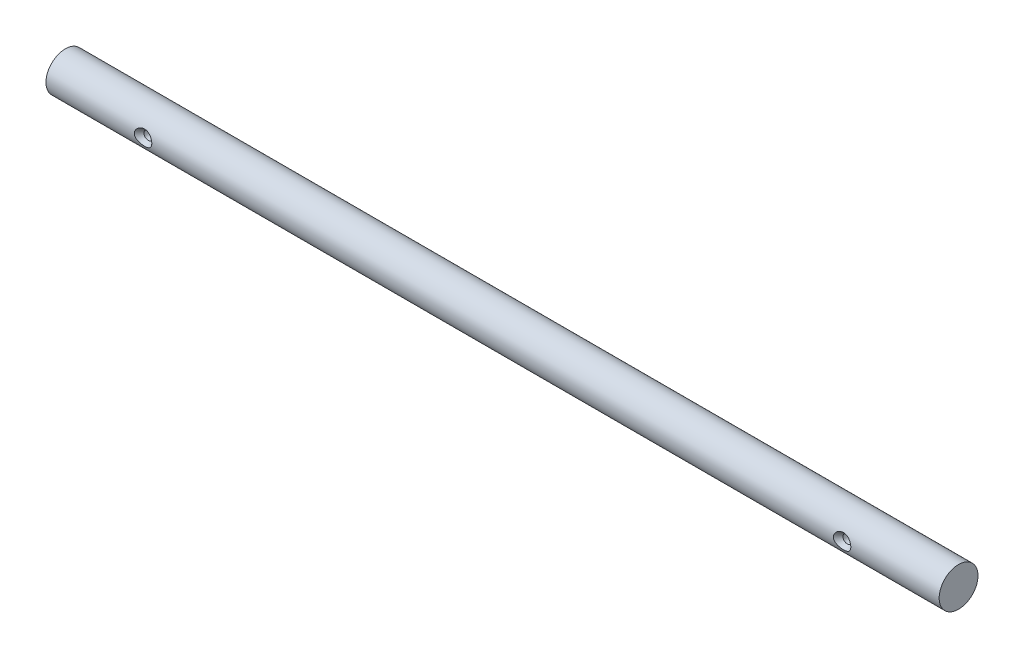
ISO-10303-21;
HEADER;
FILE_DESCRIPTION(('STEP AP214'),'2;1');
FILE_NAME('part.step','',(''),(''),'','','');
FILE_SCHEMA(('AUTOMOTIVE_DESIGN { 1 0 10303 214 1 1 1 1 }'));
ENDSEC;
DATA;
#1=APPLICATION_CONTEXT('core data for automotive mechanical design processes');
#2=APPLICATION_PROTOCOL_DEFINITION('international standard','automotive_design',2000,#1);
#3=PRODUCT_CONTEXT('',#1,'mechanical');
#4=PRODUCT('Part','Part','',(#3));
#5=PRODUCT_RELATED_PRODUCT_CATEGORY('part','',(#4));
#6=PRODUCT_DEFINITION_FORMATION('','',#4);
#7=PRODUCT_DEFINITION_CONTEXT('part definition',#1,'design');
#8=PRODUCT_DEFINITION('design','',#6,#7);
#9=PRODUCT_DEFINITION_SHAPE('','',#8);
#10=(LENGTH_UNIT() NAMED_UNIT(*) SI_UNIT(.MILLI.,.METRE.));
#11=(NAMED_UNIT(*) PLANE_ANGLE_UNIT() SI_UNIT($,.RADIAN.));
#12=(NAMED_UNIT(*) SI_UNIT($,.STERADIAN.) SOLID_ANGLE_UNIT());
#13=UNCERTAINTY_MEASURE_WITH_UNIT(LENGTH_MEASURE(1.E-05),#10,'distance_accuracy_value','');
#14=(GEOMETRIC_REPRESENTATION_CONTEXT(3) GLOBAL_UNCERTAINTY_ASSIGNED_CONTEXT((#13)) GLOBAL_UNIT_ASSIGNED_CONTEXT((#10,
#11,#12)) REPRESENTATION_CONTEXT('',''));
#15=CARTESIAN_POINT('',(0.,0.,0.));
#16=DIRECTION('',(0.,0.,1.));
#17=DIRECTION('',(1.,0.,0.));
#18=AXIS2_PLACEMENT_3D('',#15,#16,#17);
#19=CARTESIAN_POINT('',(0.,0.,0.));
#20=DIRECTION('',(-1.,0.,0.));
#21=DIRECTION('',(0.,0.,1.));
#22=AXIS2_PLACEMENT_3D('',#19,#20,#21);
#23=PLANE('',#22);
#24=CARTESIAN_POINT('',(0.,0.,0.));
#25=DIRECTION('',(1.,0.,0.));
#26=DIRECTION('',(0.,0.,-1.));
#27=AXIS2_PLACEMENT_3D('',#24,#25,#26);
#28=CIRCLE('',#27,6.35);
#29=CARTESIAN_POINT('',(0.,0.,-6.35));
#30=VERTEX_POINT('',#29);
#31=EDGE_CURVE('E80',#30,#30,#28,.T.);
#32=ORIENTED_EDGE('',*,*,#31,.F.);
#33=EDGE_LOOP('',(#32));
#34=FACE_BOUND('',#33,.T.);
#35=ADVANCED_FACE('F30',(#34),#23,.T.);
#36=CARTESIAN_POINT('',(292.1,0.,0.));
#37=DIRECTION('',(1.,0.,0.));
#38=DIRECTION('',(0.,0.,-1.));
#39=AXIS2_PLACEMENT_3D('',#36,#37,#38);
#40=CYLINDRICAL_SURFACE('',#39,6.35);
#41=CARTESIAN_POINT('',(33.13938,0.,-6.35));
#42=CARTESIAN_POINT('',(33.1393773693292,-0.0770580147824858,-6.34999857874277));
#43=CARTESIAN_POINT('',(33.1329476519724,-0.154147814156401,-6.34858308496043));
#44=CARTESIAN_POINT('',(33.1074253939323,-0.306137659083228,-6.34307312302267));
#45=CARTESIAN_POINT('',(33.0883238087969,-0.381036100675148,-6.33897674143153));
#46=CARTESIAN_POINT('',(33.0380847751224,-0.526424695091426,-6.328561097657));
#47=CARTESIAN_POINT('',(33.0069599029788,-0.596919365061055,-6.32224415880273));
#48=CARTESIAN_POINT('',(32.9335977338347,-0.73168349467798,-6.30806915643153));
#49=CARTESIAN_POINT('',(32.8913607230078,-0.795953114582171,-6.30021113260386));
#50=CARTESIAN_POINT('',(32.7962555294635,-0.917477209239904,-6.28367369849354));
#51=CARTESIAN_POINT('',(32.7432431049937,-0.974617422623804,-6.27498409530254));
#52=CARTESIAN_POINT('',(32.6284015691618,-1.07926995292355,-6.25783468788869));
#53=CARTESIAN_POINT('',(32.5665716720922,-1.12678141092561,-6.24937490422467));
#54=CARTESIAN_POINT('',(32.4350054027128,-1.21133196031775,-6.23354247239593));
#55=CARTESIAN_POINT('',(32.3651891381993,-1.24824939821349,-6.22618288469931));
#56=CARTESIAN_POINT('',(32.2201561075782,-1.30978360304534,-6.21353042278975));
#57=CARTESIAN_POINT('',(32.144939988896,-1.33440184180865,-6.20823730130239));
#58=CARTESIAN_POINT('',(31.9924818392094,-1.37026118061588,-6.20042088210204));
#59=CARTESIAN_POINT('',(31.9152895833558,-1.38170458723359,-6.19785574294637));
#60=CARTESIAN_POINT('',(31.7600415299631,-1.39151847243378,-6.19566005707016));
#61=CARTESIAN_POINT('',(31.6819858398199,-1.38989055899891,-6.19602914939189));
#62=CARTESIAN_POINT('',(31.5287307499351,-1.37377081655859,-6.19962234430798));
#63=CARTESIAN_POINT('',(31.4535052205079,-1.35951401975773,-6.20279428139562));
#64=CARTESIAN_POINT('',(31.3065402225408,-1.3189135770539,-6.21155328983817));
#65=CARTESIAN_POINT('',(31.2348009499507,-1.2925692526221,-6.21714049677233));
#66=CARTESIAN_POINT('',(31.0961842162134,-1.22832579365377,-6.23015190535229));
#67=CARTESIAN_POINT('',(31.0293500305677,-1.19033629647085,-6.23759038418603));
#68=CARTESIAN_POINT('',(30.9029181150517,-1.10394441233894,-6.25345745137758));
#69=CARTESIAN_POINT('',(30.8433213739665,-1.05554060507709,-6.26188617471455));
#70=CARTESIAN_POINT('',(30.7317029472496,-0.948450032439781,-6.27900783584624));
#71=CARTESIAN_POINT('',(30.6798730878444,-0.889563416097779,-6.28770254422279));
#72=CARTESIAN_POINT('',(30.5867933326881,-0.76383558608672,-6.30421040579583));
#73=CARTESIAN_POINT('',(30.5455436288326,-0.696994228172171,-6.31202354300154));
#74=CARTESIAN_POINT('',(30.4747476536318,-0.557020060639089,-6.32591332023522));
#75=CARTESIAN_POINT('',(30.4452265323504,-0.483874135982693,-6.33198622092096));
#76=CARTESIAN_POINT('',(30.3989476557356,-0.333497502249384,-6.34168347684545));
#77=CARTESIAN_POINT('',(30.3821880431274,-0.256267389324258,-6.34530818837819));
#78=CARTESIAN_POINT('',(30.3621869699033,-0.101560078405072,-6.34964994117617));
#79=CARTESIAN_POINT('',(30.3586834735669,-0.024118293878334,-6.3504233368628));
#80=CARTESIAN_POINT('',(30.3645838296629,0.130244013614943,-6.34913324325954));
#81=CARTESIAN_POINT('',(30.3739868060276,0.207164571605239,-6.34706994651913));
#82=CARTESIAN_POINT('',(30.4052159177798,0.357432634819869,-6.34037386918713));
#83=CARTESIAN_POINT('',(30.4269046024549,0.430810085281029,-6.33576953181242));
#84=CARTESIAN_POINT('',(30.4819368938108,0.572885459373146,-6.32450673908385));
#85=CARTESIAN_POINT('',(30.5152814938842,0.64158298355397,-6.31784810865551));
#86=CARTESIAN_POINT('',(30.5932249679566,0.773431850410465,-6.30307634425202));
#87=CARTESIAN_POINT('',(30.637977761759,0.836489978839934,-6.29494379675881));
#88=CARTESIAN_POINT('',(30.7372645793845,0.954295331885906,-6.2781659209662));
#89=CARTESIAN_POINT('',(30.7917998744558,1.00904147464023,-6.2695205261195));
#90=CARTESIAN_POINT('',(30.9103060757569,1.10970487639385,-6.25249668325041));
#91=CARTESIAN_POINT('',(30.9744324515943,1.15544068489934,-6.24412609909112));
#92=CARTESIAN_POINT('',(31.1096099590884,1.23549453859408,-6.22878169184795));
#93=CARTESIAN_POINT('',(31.1806607909031,1.26981307788895,-6.22180780832421));
#94=CARTESIAN_POINT('',(31.3272893251319,1.32582641516228,-6.21011302415152));
#95=CARTESIAN_POINT('',(31.4028388515878,1.34759220093339,-6.20537948187808));
#96=CARTESIAN_POINT('',(31.5566398834397,1.37809008069913,-6.19867856860867));
#97=CARTESIAN_POINT('',(31.6348909543802,1.38682426050609,-6.19671075493874));
#98=CARTESIAN_POINT('',(31.7900442496229,1.39092218175196,-6.19579200911915));
#99=CARTESIAN_POINT('',(31.8669386302404,1.38657362845695,-6.1967761582677));
#100=CARTESIAN_POINT('',(32.0188704828808,1.3652727454965,-6.20150362365569));
#101=CARTESIAN_POINT('',(32.0939079768045,1.34832056455649,-6.20524690733677));
#102=CARTESIAN_POINT('',(32.2397672945577,1.30243267585033,-6.21503921261245));
#103=CARTESIAN_POINT('',(32.3106028768447,1.27353886511061,-6.22108016701532));
#104=CARTESIAN_POINT('',(32.4464637516927,1.20462388768542,-6.23479031143629));
#105=CARTESIAN_POINT('',(32.5114884375194,1.16460156082527,-6.24245967119986));
#106=CARTESIAN_POINT('',(32.6352999052727,1.07361148825533,-6.25875638822438));
#107=CARTESIAN_POINT('',(32.6939339045511,1.02243871878343,-6.26739998548295));
#108=CARTESIAN_POINT('',(32.8018768922185,0.911015806512834,-6.28456215578055));
#109=CARTESIAN_POINT('',(32.8511837217864,0.850763568008113,-6.29308069945548));
#110=CARTESIAN_POINT('',(32.9396855818554,0.721949374331485,-6.30916412372919));
#111=CARTESIAN_POINT('',(32.9787410159626,0.653289687853506,-6.31671518665392));
#112=CARTESIAN_POINT('',(33.0446951641992,0.510229541277854,-6.3298741969798));
#113=CARTESIAN_POINT('',(33.0716040697997,0.435833955452653,-6.33548377244885));
#114=CARTESIAN_POINT('',(33.1077075939413,0.301137270444414,-6.34312730669384));
#115=CARTESIAN_POINT('',(33.1195620761019,0.241564649946528,-6.34568859850302));
#116=CARTESIAN_POINT('',(33.1353991402318,0.121334556624935,-6.34912546732602));
#117=CARTESIAN_POINT('',(33.1393820714465,0.0606771320523982,-6.3500011191284));
#118=CARTESIAN_POINT('',(33.13938,0.,-6.35));
#119=B_SPLINE_CURVE_WITH_KNOTS('',3,(#41,#42,#43,#44,#45,#46,#47,#48,#49,#50,#51,#52,#53,#54,
#55,#56,#57,#58,#59,#60,#61,#62,#63,#64,#65,#66,#67,#68,#69,#70,#71,#72,#73,#74,#75,#76,#77,#78,
#79,#80,#81,#82,#83,#84,#85,#86,#87,#88,#89,#90,#91,#92,#93,#94,#95,#96,#97,#98,#99,#100,#101,
#102,#103,#104,#105,#106,#107,#108,#109,#110,#111,#112,#113,#114,#115,#116,#117,#118),
.UNSPECIFIED.,.T.,.F.,(4,2,2,2,2,2,2,2,2,2,2,2,2,2,2,2,2,2,2,2,2,2,2,2,2,2,2,2,2,2,2,2,2,2,2,2,
2,2,4),(0.,0.230951940857169,0.462068899562563,0.69294476097694,0.923814677171986,
1.15800694130668,1.39222008690595,1.62902398247448,1.86579953327489,2.09888862772947,
2.33194904891484,2.56076110297457,2.7895860028849,3.02023349107055,3.25091245512734,
3.48658316413121,3.72225814726751,3.95843580469085,4.19457908289963,4.42602933025139,
4.65746386796126,4.88635888902543,5.11527342276543,5.34745704157228,5.57967085481695,
5.81616734043596,6.05265358985508,6.28778901645182,6.52288680371194,6.7528525717016,
6.98281562609057,7.211978617029,7.4411655077257,7.67498828872929,7.90886512317244,
8.14577845922403,8.38249264339039,8.56435721966337,8.74621372677303),.UNSPECIFIED.);
#120=CARTESIAN_POINT('',(33.13938,0.,-6.35));
#121=VERTEX_POINT('',#120);
#122=EDGE_CURVE('E10',#121,#121,#119,.T.);
#123=ORIENTED_EDGE('',*,*,#122,.F.);
#124=EDGE_LOOP('',(#123));
#125=FACE_BOUND('',#124,.T.);
#126=CARTESIAN_POINT('',(29.852150553368,-1.81624066154618,6.08471610327792));
#127=CARTESIAN_POINT('',(29.983893034176,-1.91633120515935,6.05484173858715));
#128=CARTESIAN_POINT('',(30.1247887398243,-2.0048824353391,6.02573421415294));
#129=CARTESIAN_POINT('',(30.420263049166,-2.1580335174929,5.97260446281971));
#130=CARTESIAN_POINT('',(30.5748794361877,-2.2225645188501,5.94859693751657));
#131=CARTESIAN_POINT('',(30.8939163102546,-2.32691973306626,5.90856095066437));
#132=CARTESIAN_POINT('',(31.0583722617018,-2.36664783779372,5.89256357423695));
#133=CARTESIAN_POINT('',(31.3919431494529,-2.42033846190325,5.87071667171876));
#134=CARTESIAN_POINT('',(31.5610538815763,-2.43432350436385,5.86485827511678));
#135=CARTESIAN_POINT('',(31.9029901556569,-2.43635740691875,5.86401497767654));
#136=CARTESIAN_POINT('',(32.0758198478485,-2.42386111364003,5.86925862513264));
#137=CARTESIAN_POINT('',(32.416792839006,-2.37205488948279,5.89038378775734));
#138=CARTESIAN_POINT('',(32.5849344798725,-2.33273559381763,5.90626901821542));
#139=CARTESIAN_POINT('',(32.9116868336232,-2.22794843703089,5.94658554039485));
#140=CARTESIAN_POINT('',(33.0703022609238,-2.1624936348149,5.9710125633555));
#141=CARTESIAN_POINT('',(33.3736291287116,-2.00611648986254,6.02534895170443));
#142=CARTESIAN_POINT('',(33.5183308800871,-1.91517657002957,6.05526209593494));
#143=CARTESIAN_POINT('',(33.7869594401066,-1.71000137597698,6.11634776629401));
#144=CARTESIAN_POINT('',(33.9111281790728,-1.59607876016986,6.14749930468939));
#145=CARTESIAN_POINT('',(34.1348296841205,-1.34565421071616,6.2071033919324));
#146=CARTESIAN_POINT('',(34.2344218992959,-1.20920812257714,6.23556234896639));
#147=CARTESIAN_POINT('',(34.3766179918882,-0.961391073432815,6.27765075728272));
#148=CARTESIAN_POINT('',(34.4273445269256,-0.854972147489217,6.29315979964208));
#149=CARTESIAN_POINT('',(34.5110786669511,-0.634792353641713,6.31915964640815));
#150=CARTESIAN_POINT('',(34.544102014817,-0.521038110004516,6.32965490850181));
#151=CARTESIAN_POINT('',(34.5905636748405,-0.288632855271778,6.34450909044047));
#152=CARTESIAN_POINT('',(34.6039145077902,-0.169962370332107,6.34884059856583));
#153=CARTESIAN_POINT('',(34.6098188952831,0.0679559025919478,6.35074973667515));
#154=CARTESIAN_POINT('',(34.6023744170782,0.187203634902937,6.34832800552062));
#155=CARTESIAN_POINT('',(34.5684863903753,0.413937108951206,6.33743940624847));
#156=CARTESIAN_POINT('',(34.543429108548,0.521656874450541,6.32941388870435));
#157=CARTESIAN_POINT('',(34.4772449595666,0.731520780935922,6.30860596289637));
#158=CARTESIAN_POINT('',(34.4361151548408,0.833663898787549,6.29582268507801));
#159=CARTESIAN_POINT('',(34.3369412404447,1.03601288164455,6.26579911037888));
#160=CARTESIAN_POINT('',(34.2780676716037,1.13577759843027,6.24834654791709));
#161=CARTESIAN_POINT('',(34.1468721098103,1.32545865929011,6.21087959583365));
#162=CARTESIAN_POINT('',(34.0745438801387,1.41537040531879,6.19086401950923));
#163=CARTESIAN_POINT('',(33.9060990940677,1.59811384309511,6.1464416005378));
#164=CARTESIAN_POINT('',(33.8080276523974,1.6890956406936,6.1218457538739));
#165=CARTESIAN_POINT('',(33.5996734999224,1.85600603218745,6.07332764162454));
#166=CARTESIAN_POINT('',(33.4893825367807,1.93192435534584,6.04940584509741));
#167=CARTESIAN_POINT('',(33.2396073251349,2.07979804308314,6.00033425677048));
#168=CARTESIAN_POINT('',(33.098340184475,2.14891260877817,5.97566080216775));
#169=CARTESIAN_POINT('',(32.8061955503279,2.26533744168808,5.9325043167026));
#170=CARTESIAN_POINT('',(32.6553145697847,2.31263974549918,5.91402354738972));
#171=CARTESIAN_POINT('',(32.3346126375963,2.387883992868,5.88407345014686));
#172=CARTESIAN_POINT('',(32.1642625489929,2.41387792995101,5.87331902758028));
#173=CARTESIAN_POINT('',(31.8212749150074,2.43908751054452,5.86289528679997));
#174=CARTESIAN_POINT('',(31.6486374817637,2.43830446199167,5.86322542715464));
#175=CARTESIAN_POINT('',(31.3055980166139,2.40995768484556,5.87493261105867));
#176=CARTESIAN_POINT('',(31.1352013521347,2.38233851986068,5.88633252182543));
#177=CARTESIAN_POINT('',(30.8017054257706,2.30071198466786,5.91871038188049));
#178=CARTESIAN_POINT('',(30.6386101962725,2.24669022457123,5.93969355380915));
#179=CARTESIAN_POINT('',(30.3237149574728,2.11270798253269,5.98866120578683));
#180=CARTESIAN_POINT('',(30.1719665637823,2.03263690169595,6.01667541988281));
#181=CARTESIAN_POINT('',(29.8853888619216,1.84740464475632,6.07610249313442));
#182=CARTESIAN_POINT('',(29.750544482866,1.74226606400313,6.10751227773317));
#183=CARTESIAN_POINT('',(29.5289773230813,1.53231514569888,6.16309312742739));
#184=CARTESIAN_POINT('',(29.4380730887449,1.43195025278158,6.18741540840368));
#185=CARTESIAN_POINT('',(29.2737398346302,1.21715174493914,6.23322300764632));
#186=CARTESIAN_POINT('',(29.2003014464659,1.10272572235212,6.25470984403163));
#187=CARTESIAN_POINT('',(29.0741428381694,0.860744072124808,6.29259213463222));
#188=CARTESIAN_POINT('',(29.0216092870923,0.733082441325786,6.30894145319168));
#189=CARTESIAN_POINT('',(28.9420538080155,0.469337338933305,6.33400863409282));
#190=CARTESIAN_POINT('',(28.9149995654535,0.33326476882193,6.34273616187421));
#191=CARTESIAN_POINT('',(28.8906539597357,0.0788137138820113,6.35059267621135));
#192=CARTESIAN_POINT('',(28.8895184436734,-0.0391695533280658,6.35096134734281));
#193=CARTESIAN_POINT('',(28.907385636344,-0.27341095094509,6.34519135489133));
#194=CARTESIAN_POINT('',(28.9263829723383,-0.389669533215369,6.33905442742006));
#195=CARTESIAN_POINT('',(28.9816090270807,-0.610372606760424,6.32151247873844));
#196=CARTESIAN_POINT('',(29.0167838478323,-0.715112005587188,6.31043075037464));
#197=CARTESIAN_POINT('',(29.1021309715564,-0.91774604657452,6.28416231954805));
#198=CARTESIAN_POINT('',(29.1523120037259,-1.01563666375067,6.268973228303));
#199=CARTESIAN_POINT('',(29.2711839203473,-1.21217356396608,6.23410440150852));
#200=CARTESIAN_POINT('',(29.3412049603137,-1.30995772749041,6.21413078568287));
#201=CARTESIAN_POINT('',(29.4942213686944,-1.49413915403202,6.17243615866609));
#202=CARTESIAN_POINT('',(29.5772046610233,-1.58054687902443,6.15071678293721));
#203=CARTESIAN_POINT('',(29.7253606392966,-1.71548107277748,6.11414856808458));
#204=CARTESIAN_POINT('',(29.7876588657767,-1.76724349654702,6.0993404536227));
#205=CARTESIAN_POINT('',(29.852150553368,-1.81624066154618,6.08471610327792));
#206=B_SPLINE_CURVE_WITH_KNOTS('',3,(#126,#127,#128,#129,#130,#131,#132,#133,#134,#135,#136,
#137,#138,#139,#140,#141,#142,#143,#144,#145,#146,#147,#148,#149,#150,#151,#152,#153,#154,#155,
#156,#157,#158,#159,#160,#161,#162,#163,#164,#165,#166,#167,#168,#169,#170,#171,#172,#173,#174,
#175,#176,#177,#178,#179,#180,#181,#182,#183,#184,#185,#186,#187,#188,#189,#190,#191,#192,#193,
#194,#195,#196,#197,#198,#199,#200,#201,#202,#203,#204,#205),.UNSPECIFIED.,.T.,.F.,(4,2,2,2,2,2,
2,2,2,2,2,2,2,2,2,2,2,2,2,2,2,2,2,2,2,2,2,2,2,2,2,2,2,2,2,2,2,2,2,4),(0.,0.504116447962319,
1.00966694663685,1.51716442621644,2.02421767548972,2.54181056304412,3.05958425173586,
3.57709955196317,4.09497266489366,4.6062255258331,5.11622930066992,5.47150010945343,
5.82645446098345,6.18298249990775,6.53947681215577,6.87066349316751,7.20191073343105,
7.55201128920503,7.90227453539818,8.30878737801689,8.71557644817255,9.19115070295077,
9.66689844717362,10.1823992741102,10.6978749211605,11.2144176747816,11.7312422679559,
12.250290449606,12.7688725285706,13.1799894175568,13.5908852905002,14.0053720662602,
14.4193324514529,14.7714196722223,15.1234129571493,15.4551614878697,15.7871033751997,
16.1515040447337,16.5155672287515,16.7623465536302),.UNSPECIFIED.);
#207=CARTESIAN_POINT('',(29.852150553368,-1.81624066154618,6.08471610327792));
#208=VERTEX_POINT('',#207);
#209=EDGE_CURVE('E40',#208,#208,#206,.T.);
#210=ORIENTED_EDGE('',*,*,#209,.F.);
#211=EDGE_LOOP('',(#210));
#212=FACE_BOUND('',#211,.T.);
#213=CARTESIAN_POINT('',(261.73938,0.,-6.35));
#214=CARTESIAN_POINT('',(261.739377369329,-0.0770580147824851,-6.34999857874277));
#215=CARTESIAN_POINT('',(261.732947651972,-0.154147814156402,-6.34858308496043));
#216=CARTESIAN_POINT('',(261.707425393932,-0.306137659083225,-6.34307312302267));
#217=CARTESIAN_POINT('',(261.688323808797,-0.381036100675141,-6.33897674143153));
#218=CARTESIAN_POINT('',(261.638084775122,-0.52642469509143,-6.328561097657));
#219=CARTESIAN_POINT('',(261.606959902979,-0.596919365061076,-6.32224415880273));
#220=CARTESIAN_POINT('',(261.533597733835,-0.731683494677999,-6.30806915643153));
#221=CARTESIAN_POINT('',(261.491360723008,-0.795953114582172,-6.30021113260386));
#222=CARTESIAN_POINT('',(261.396255529463,-0.91747720923989,-6.28367369849354));
#223=CARTESIAN_POINT('',(261.343243104994,-0.974617422623793,-6.27498409530254));
#224=CARTESIAN_POINT('',(261.228401569162,-1.07926995292355,-6.25783468788869));
#225=CARTESIAN_POINT('',(261.166571672092,-1.12678141092561,-6.24937490422467));
#226=CARTESIAN_POINT('',(261.035005402713,-1.21133196031776,-6.23354247239593));
#227=CARTESIAN_POINT('',(260.965189138199,-1.2482493982135,-6.22618288469931));
#228=CARTESIAN_POINT('',(260.820156107578,-1.30978360304535,-6.21353042278975));
#229=CARTESIAN_POINT('',(260.744939988896,-1.33440184180865,-6.20823730130239));
#230=CARTESIAN_POINT('',(260.592481839209,-1.37026118061588,-6.20042088210204));
#231=CARTESIAN_POINT('',(260.515289583356,-1.3817045872336,-6.19785574294637));
#232=CARTESIAN_POINT('',(260.360041529963,-1.39151847243378,-6.19566005707016));
#233=CARTESIAN_POINT('',(260.28198583982,-1.38989055899891,-6.19602914939189));
#234=CARTESIAN_POINT('',(260.128730749935,-1.37377081655858,-6.19962234430798));
#235=CARTESIAN_POINT('',(260.053505220508,-1.35951401975771,-6.20279428139562));
#236=CARTESIAN_POINT('',(259.906540222541,-1.31891357705389,-6.21155328983817));
#237=CARTESIAN_POINT('',(259.834800949951,-1.2925692526221,-6.21714049677233));
#238=CARTESIAN_POINT('',(259.696184216213,-1.22832579365377,-6.23015190535229));
#239=CARTESIAN_POINT('',(259.629350030568,-1.19033629647084,-6.23759038418603));
#240=CARTESIAN_POINT('',(259.502918115052,-1.10394441233894,-6.25345745137758));
#241=CARTESIAN_POINT('',(259.443321373966,-1.05554060507711,-6.26188617471455));
#242=CARTESIAN_POINT('',(259.33170294725,-0.948450032439813,-6.27900783584624));
#243=CARTESIAN_POINT('',(259.279873087844,-0.8895634160978,-6.28770254422279));
#244=CARTESIAN_POINT('',(259.186793332688,-0.763835586086732,-6.30421040579583));
#245=CARTESIAN_POINT('',(259.145543628833,-0.696994228172182,-6.31202354300154));
#246=CARTESIAN_POINT('',(259.074747653632,-0.557020060639106,-6.32591332023522));
#247=CARTESIAN_POINT('',(259.04522653235,-0.483874135982718,-6.33198622092095));
#248=CARTESIAN_POINT('',(258.998947655736,-0.333497502249418,-6.34168347684544));
#249=CARTESIAN_POINT('',(258.982188043127,-0.256267389324294,-6.34530818837818));
#250=CARTESIAN_POINT('',(258.962186969903,-0.101560078405106,-6.34964994117617));
#251=CARTESIAN_POINT('',(258.958683473567,-0.0241182938783631,-6.3504233368628));
#252=CARTESIAN_POINT('',(258.964583829663,0.130244013614923,-6.34913324325954));
#253=CARTESIAN_POINT('',(258.973986806028,0.207164571605224,-6.34706994651913));
#254=CARTESIAN_POINT('',(259.00521591778,0.35743263481986,-6.34037386918713));
#255=CARTESIAN_POINT('',(259.026904602455,0.430810085281021,-6.33576953181242));
#256=CARTESIAN_POINT('',(259.081936893811,0.572885459373134,-6.32450673908385));
#257=CARTESIAN_POINT('',(259.115281493884,0.641582983553955,-6.31784810865551));
#258=CARTESIAN_POINT('',(259.193224967957,0.773431850410428,-6.30307634425202));
#259=CARTESIAN_POINT('',(259.237977761759,0.836489978839882,-6.29494379675882));
#260=CARTESIAN_POINT('',(259.337264579384,0.954295331885867,-6.27816592096621));
#261=CARTESIAN_POINT('',(259.391799874456,1.00904147464021,-6.2695205261195));
#262=CARTESIAN_POINT('',(259.510306075757,1.10970487639385,-6.25249668325041));
#263=CARTESIAN_POINT('',(259.574432451594,1.15544068489932,-6.24412609909112));
#264=CARTESIAN_POINT('',(259.709609959088,1.23549453859406,-6.22878169184796));
#265=CARTESIAN_POINT('',(259.780660790903,1.26981307788894,-6.22180780832421));
#266=CARTESIAN_POINT('',(259.927289325132,1.32582641516228,-6.21011302415152));
#267=CARTESIAN_POINT('',(260.002838851588,1.34759220093339,-6.20537948187808));
#268=CARTESIAN_POINT('',(260.15663988344,1.37809008069913,-6.19867856860867));
#269=CARTESIAN_POINT('',(260.23489095438,1.38682426050609,-6.19671075493874));
#270=CARTESIAN_POINT('',(260.390044249623,1.39092218175196,-6.19579200911915));
#271=CARTESIAN_POINT('',(260.46693863024,1.38657362845695,-6.1967761582677));
#272=CARTESIAN_POINT('',(260.618870482881,1.3652727454965,-6.20150362365569));
#273=CARTESIAN_POINT('',(260.693907976804,1.3483205645565,-6.20524690733677));
#274=CARTESIAN_POINT('',(260.839767294558,1.30243267585033,-6.21503921261245));
#275=CARTESIAN_POINT('',(260.910602876845,1.27353886511061,-6.22108016701532));
#276=CARTESIAN_POINT('',(261.046463751693,1.20462388768541,-6.23479031143629));
#277=CARTESIAN_POINT('',(261.111488437519,1.16460156082526,-6.24245967119986));
#278=CARTESIAN_POINT('',(261.235299905273,1.07361148825532,-6.25875638822439));
#279=CARTESIAN_POINT('',(261.293933904551,1.02243871878341,-6.26739998548295));
#280=CARTESIAN_POINT('',(261.401876892219,0.911015806512812,-6.28456215578056));
#281=CARTESIAN_POINT('',(261.451183721786,0.850763568008095,-6.29308069945549));
#282=CARTESIAN_POINT('',(261.539685581855,0.721949374331476,-6.30916412372919));
#283=CARTESIAN_POINT('',(261.578741015963,0.653289687853503,-6.31671518665392));
#284=CARTESIAN_POINT('',(261.644695164199,0.510229541277872,-6.32987419697979));
#285=CARTESIAN_POINT('',(261.6716040698,0.435833955452688,-6.33548377244885));
#286=CARTESIAN_POINT('',(261.707707593941,0.301137270444452,-6.34312730669384));
#287=CARTESIAN_POINT('',(261.719562076102,0.241564649946554,-6.34568859850302));
#288=CARTESIAN_POINT('',(261.735399140232,0.121334556624944,-6.34912546732602));
#289=CARTESIAN_POINT('',(261.739382071446,0.0606771320524035,-6.3500011191284));
#290=CARTESIAN_POINT('',(261.73938,0.,-6.35));
#291=B_SPLINE_CURVE_WITH_KNOTS('',3,(#213,#214,#215,#216,#217,#218,#219,#220,#221,#222,#223,
#224,#225,#226,#227,#228,#229,#230,#231,#232,#233,#234,#235,#236,#237,#238,#239,#240,#241,#242,
#243,#244,#245,#246,#247,#248,#249,#250,#251,#252,#253,#254,#255,#256,#257,#258,#259,#260,#261,
#262,#263,#264,#265,#266,#267,#268,#269,#270,#271,#272,#273,#274,#275,#276,#277,#278,#279,#280,
#281,#282,#283,#284,#285,#286,#287,#288,#289,#290),.UNSPECIFIED.,.T.,.F.,(4,2,2,2,2,2,2,2,2,2,2,
2,2,2,2,2,2,2,2,2,2,2,2,2,2,2,2,2,2,2,2,2,2,2,2,2,2,2,4),(0.,0.230951940857169,
0.462068899562558,0.692944760976954,0.92381467717199,1.15800694130667,1.39222008690598,
1.6290239824745,1.86579953327488,2.09888862772954,2.33194904891484,2.56076110297461,
2.78958600288491,3.02023349107054,3.25091245512732,3.48658316413118,3.72225814726749,
3.95843580469081,4.19457908289958,4.42602933025135,4.65746386796123,4.8863588890254,
5.11527342276542,5.34745704157219,5.57967085481691,5.81616734043592,6.05265358985504,
6.28778901645178,6.52288680371193,6.75285257170161,6.98281562609053,7.21197861702899,
7.44116550772569,7.6749882887293,7.90886512317247,8.14577845922402,8.38249264339033,
8.56435721966334,8.74621372677302),.UNSPECIFIED.);
#292=CARTESIAN_POINT('',(261.73938,0.,-6.35));
#293=VERTEX_POINT('',#292);
#294=EDGE_CURVE('E44',#293,#293,#291,.T.);
#295=ORIENTED_EDGE('',*,*,#294,.F.);
#296=EDGE_LOOP('',(#295));
#297=FACE_BOUND('',#296,.T.);
#298=CARTESIAN_POINT('',(258.452150553368,-1.81624066154619,6.08471610327793));
#299=CARTESIAN_POINT('',(258.583893034176,-1.91633120515936,6.05484173858716));
#300=CARTESIAN_POINT('',(258.724788739824,-2.00488243533911,6.02573421415294));
#301=CARTESIAN_POINT('',(259.020263049166,-2.15803351749292,5.97260446281971));
#302=CARTESIAN_POINT('',(259.174879436188,-2.22256451885011,5.94859693751657));
#303=CARTESIAN_POINT('',(259.493916310255,-2.32691973306628,5.90856095066436));
#304=CARTESIAN_POINT('',(259.658372261702,-2.36664783779373,5.89256357423695));
#305=CARTESIAN_POINT('',(259.991943149453,-2.42033846190326,5.87071667171876));
#306=CARTESIAN_POINT('',(260.161053881576,-2.43432350436386,5.86485827511678));
#307=CARTESIAN_POINT('',(260.502990155657,-2.43635740691876,5.86401497767654));
#308=CARTESIAN_POINT('',(260.675819847848,-2.42386111364004,5.86925862513264));
#309=CARTESIAN_POINT('',(261.016792839006,-2.37205488948281,5.89038378775733));
#310=CARTESIAN_POINT('',(261.184934479872,-2.33273559381765,5.90626901821541));
#311=CARTESIAN_POINT('',(261.511686833623,-2.22794843703091,5.94658554039484));
#312=CARTESIAN_POINT('',(261.670302260924,-2.16249363481493,5.97101256335549));
#313=CARTESIAN_POINT('',(261.973629128712,-2.00611648986257,6.02534895170442));
#314=CARTESIAN_POINT('',(262.118330880087,-1.9151765700296,6.05526209593494));
#315=CARTESIAN_POINT('',(262.386959440107,-1.71000137597701,6.116347766294));
#316=CARTESIAN_POINT('',(262.511128179073,-1.59607876016988,6.14749930468939));
#317=CARTESIAN_POINT('',(262.73482968412,-1.34565421071619,6.20710339193239));
#318=CARTESIAN_POINT('',(262.834421899296,-1.20920812257716,6.23556234896638));
#319=CARTESIAN_POINT('',(262.976617991888,-0.96139107343283,6.27765075728271));
#320=CARTESIAN_POINT('',(263.027344526926,-0.854972147489233,6.29315979964207));
#321=CARTESIAN_POINT('',(263.111078666951,-0.634792353641735,6.31915964640815));
#322=CARTESIAN_POINT('',(263.144102014817,-0.521038110004544,6.32965490850181));
#323=CARTESIAN_POINT('',(263.19056367484,-0.288632855271811,6.34450909044047));
#324=CARTESIAN_POINT('',(263.20391450779,-0.169962370332142,6.34884059856583));
#325=CARTESIAN_POINT('',(263.209818895283,0.0679559025919077,6.35074973667515));
#326=CARTESIAN_POINT('',(263.202374417078,0.187203634902892,6.34832800552062));
#327=CARTESIAN_POINT('',(263.168486390375,0.413937108951162,6.33743940624848));
#328=CARTESIAN_POINT('',(263.143429108548,0.521656874450501,6.32941388870435));
#329=CARTESIAN_POINT('',(263.077244959567,0.731520780935881,6.30860596289638));
#330=CARTESIAN_POINT('',(263.036115154841,0.833663898787504,6.29582268507801));
#331=CARTESIAN_POINT('',(262.936941240445,1.0360128816445,6.26579911037888));
#332=CARTESIAN_POINT('',(262.878067671604,1.13577759843023,6.2483465479171));
#333=CARTESIAN_POINT('',(262.74687210981,1.32545865929007,6.21087959583365));
#334=CARTESIAN_POINT('',(262.674543880139,1.41537040531875,6.19086401950924));
#335=CARTESIAN_POINT('',(262.506099094068,1.59811384309507,6.14644160053781));
#336=CARTESIAN_POINT('',(262.408027652397,1.68909564069356,6.12184575387391));
#337=CARTESIAN_POINT('',(262.199673499922,1.85600603218741,6.07332764162455));
#338=CARTESIAN_POINT('',(262.089382536781,1.93192435534579,6.04940584509743));
#339=CARTESIAN_POINT('',(261.839607325135,2.0797980430831,6.00033425677049));
#340=CARTESIAN_POINT('',(261.698340184475,2.14891260877813,5.97566080216776));
#341=CARTESIAN_POINT('',(261.406195550328,2.26533744168806,5.93250431670261));
#342=CARTESIAN_POINT('',(261.255314569785,2.31263974549917,5.91402354738973));
#343=CARTESIAN_POINT('',(260.934612637596,2.38788399286801,5.88407345014686));
#344=CARTESIAN_POINT('',(260.764262548993,2.41387792995101,5.87331902758028));
#345=CARTESIAN_POINT('',(260.421274915007,2.43908751054453,5.86289528679997));
#346=CARTESIAN_POINT('',(260.248637481764,2.43830446199168,5.86322542715463));
#347=CARTESIAN_POINT('',(259.905598016614,2.40995768484557,5.87493261105866));
#348=CARTESIAN_POINT('',(259.735201352135,2.3823385198607,5.88633252182542));
#349=CARTESIAN_POINT('',(259.401705425771,2.30071198466787,5.91871038188049));
#350=CARTESIAN_POINT('',(259.238610196272,2.24669022457125,5.93969355380914));
#351=CARTESIAN_POINT('',(258.923714957473,2.11270798253273,5.98866120578681));
#352=CARTESIAN_POINT('',(258.771966563782,2.03263690169599,6.01667541988279));
#353=CARTESIAN_POINT('',(258.485388861922,1.84740464475639,6.0761024931344));
#354=CARTESIAN_POINT('',(258.350544482866,1.74226606400319,6.10751227773315));
#355=CARTESIAN_POINT('',(258.128977323081,1.53231514569895,6.16309312742737));
#356=CARTESIAN_POINT('',(258.038073088745,1.43195025278165,6.18741540840366));
#357=CARTESIAN_POINT('',(257.87373983463,1.21715174493921,6.2332230076463));
#358=CARTESIAN_POINT('',(257.800301446466,1.10272572235218,6.25470984403163));
#359=CARTESIAN_POINT('',(257.674142838169,0.860744072124865,6.29259213463221));
#360=CARTESIAN_POINT('',(257.621609287092,0.733082441325846,6.30894145319168));
#361=CARTESIAN_POINT('',(257.542053808015,0.46933733893337,6.33400863409282));
#362=CARTESIAN_POINT('',(257.514999565454,0.333264768821995,6.34273616187421));
#363=CARTESIAN_POINT('',(257.490653959736,0.0788137138820712,6.35059267621135));
#364=CARTESIAN_POINT('',(257.489518443673,-0.0391695533280124,6.35096134734281));
#365=CARTESIAN_POINT('',(257.507385636344,-0.273410950945042,6.34519135489134));
#366=CARTESIAN_POINT('',(257.526382972338,-0.38966953321532,6.33905442742007));
#367=CARTESIAN_POINT('',(257.581609027081,-0.610372606760378,6.32151247873844));
#368=CARTESIAN_POINT('',(257.616783847832,-0.715112005587143,6.31043075037465));
#369=CARTESIAN_POINT('',(257.702130971556,-0.917746046574484,6.28416231954806));
#370=CARTESIAN_POINT('',(257.752312003726,-1.01563666375063,6.268973228303));
#371=CARTESIAN_POINT('',(257.871183920347,-1.21217356396605,6.23410440150852));
#372=CARTESIAN_POINT('',(257.941204960314,-1.30995772749038,6.21413078568288));
#373=CARTESIAN_POINT('',(258.094221368694,-1.49413915403198,6.1724361586661));
#374=CARTESIAN_POINT('',(258.177204661023,-1.58054687902439,6.15071678293722));
#375=CARTESIAN_POINT('',(258.325360639297,-1.71548107277745,6.11414856808459));
#376=CARTESIAN_POINT('',(258.387658865777,-1.76724349654702,6.09934045362271));
#377=CARTESIAN_POINT('',(258.452150553368,-1.81624066154619,6.08471610327793));
#378=B_SPLINE_CURVE_WITH_KNOTS('',3,(#298,#299,#300,#301,#302,#303,#304,#305,#306,#307,#308,
#309,#310,#311,#312,#313,#314,#315,#316,#317,#318,#319,#320,#321,#322,#323,#324,#325,#326,#327,
#328,#329,#330,#331,#332,#333,#334,#335,#336,#337,#338,#339,#340,#341,#342,#343,#344,#345,#346,
#347,#348,#349,#350,#351,#352,#353,#354,#355,#356,#357,#358,#359,#360,#361,#362,#363,#364,#365,
#366,#367,#368,#369,#370,#371,#372,#373,#374,#375,#376,#377),.UNSPECIFIED.,.T.,.F.,(4,2,2,2,2,2,
2,2,2,2,2,2,2,2,2,2,2,2,2,2,2,2,2,2,2,2,2,2,2,2,2,2,2,2,2,2,2,2,2,4),(0.,0.504116447962331,
1.00966694663684,1.51716442621643,2.02421767548966,2.54181056304404,3.05958425173581,
3.57709955196309,4.09497266489364,4.60622552583306,5.11622930066991,5.47150010945342,
5.82645446098343,6.18298249990772,6.53947681215573,6.87066349316746,7.20191073343101,
7.55201128920497,7.90227453539813,8.30878737801683,8.71557644817246,9.19115070295072,
9.66689844717357,10.1823992741102,10.6978749211605,11.2144176747816,11.731242267956,
12.2502904496059,12.7688725285705,13.1799894175568,13.5908852905002,14.0053720662601,
14.4193324514528,14.7714196722223,15.1234129571493,15.4551614878697,15.7871033751997,
16.1515040447337,16.5155672287514,16.7623465536303),.UNSPECIFIED.);
#379=CARTESIAN_POINT('',(258.452150553368,-1.81624066154619,6.08471610327793));
#380=VERTEX_POINT('',#379);
#381=EDGE_CURVE('E48',#380,#380,#378,.T.);
#382=ORIENTED_EDGE('',*,*,#381,.F.);
#383=EDGE_LOOP('',(#382));
#384=FACE_BOUND('',#383,.T.);
#385=ORIENTED_EDGE('',*,*,#31,.T.);
#386=EDGE_LOOP('',(#385));
#387=FACE_BOUND('',#386,.T.);
#388=CARTESIAN_POINT('',(292.1,0.,0.));
#389=DIRECTION('',(1.,0.,0.));
#390=DIRECTION('',(0.,0.,-1.));
#391=AXIS2_PLACEMENT_3D('',#388,#389,#390);
#392=CIRCLE('',#391,6.35);
#393=CARTESIAN_POINT('',(292.1,0.,-6.35));
#394=VERTEX_POINT('',#393);
#395=EDGE_CURVE('E83',#394,#394,#392,.T.);
#396=ORIENTED_EDGE('',*,*,#395,.F.);
#397=EDGE_LOOP('',(#396));
#398=FACE_BOUND('',#397,.T.);
#399=ADVANCED_FACE('F59',(#125,#212,#297,#384,#387,#398),#40,.T.);
#400=CARTESIAN_POINT('',(292.1,6.35,0.));
#401=DIRECTION('',(1.,0.,0.));
#402=DIRECTION('',(0.,0.,-1.));
#403=AXIS2_PLACEMENT_3D('',#400,#401,#402);
#404=PLANE('',#403);
#405=ORIENTED_EDGE('',*,*,#395,.T.);
#406=EDGE_LOOP('',(#405));
#407=FACE_BOUND('',#406,.T.);
#408=ADVANCED_FACE('F98',(#407),#404,.T.);
#409=CARTESIAN_POINT('',(260.35,0.,6.35));
#410=DIRECTION('',(0.,0.,1.));
#411=DIRECTION('',(1.,0.,0.));
#412=AXIS2_PLACEMENT_3D('',#409,#410,#411);
#413=CYLINDRICAL_SURFACE('',#412,1.38938);
#414=ORIENTED_EDGE('',*,*,#294,.T.);
#415=EDGE_LOOP('',(#414));
#416=FACE_BOUND('',#415,.T.);
#417=CARTESIAN_POINT('',(260.35,0.,4.66112113399068));
#418=DIRECTION('',(0.,0.,1.));
#419=DIRECTION('',(1.,0.,0.));
#420=AXIS2_PLACEMENT_3D('',#417,#418,#419);
#421=CIRCLE('',#420,1.38938);
#422=CARTESIAN_POINT('',(261.73938,0.,4.66112113399068));
#423=VERTEX_POINT('',#422);
#424=EDGE_CURVE('E86',#423,#423,#421,.T.);
#425=ORIENTED_EDGE('',*,*,#424,.T.);
#426=EDGE_LOOP('',(#425));
#427=FACE_BOUND('',#426,.T.);
#428=ADVANCED_FACE('F72',(#416,#427),#413,.F.);
#429=CARTESIAN_POINT('',(260.35,0.,6.35));
#430=DIRECTION('',(0.,0.,1.));
#431=DIRECTION('',(1.,0.,0.));
#432=AXIS2_PLACEMENT_3D('',#429,#430,#431);
#433=CONICAL_SURFACE('',#432,2.85750000000001,0.715584993317676);
#434=ORIENTED_EDGE('',*,*,#381,.T.);
#435=EDGE_LOOP('',(#434));
#436=FACE_BOUND('',#435,.T.);
#437=ORIENTED_EDGE('',*,*,#424,.F.);
#438=EDGE_LOOP('',(#437));
#439=FACE_BOUND('',#438,.T.);
#440=ADVANCED_FACE('F69',(#436,#439),#433,.F.);
#441=CARTESIAN_POINT('',(31.75,0.,6.35));
#442=DIRECTION('',(0.,0.,1.));
#443=DIRECTION('',(1.,0.,0.));
#444=AXIS2_PLACEMENT_3D('',#441,#442,#443);
#445=CYLINDRICAL_SURFACE('',#444,1.38938);
#446=ORIENTED_EDGE('',*,*,#122,.T.);
#447=EDGE_LOOP('',(#446));
#448=FACE_BOUND('',#447,.T.);
#449=CARTESIAN_POINT('',(31.75,0.,4.66112113399068));
#450=DIRECTION('',(0.,0.,1.));
#451=DIRECTION('',(1.,0.,0.));
#452=AXIS2_PLACEMENT_3D('',#449,#450,#451);
#453=CIRCLE('',#452,1.38937999999999);
#454=CARTESIAN_POINT('',(33.13938,0.,4.66112113399068));
#455=VERTEX_POINT('',#454);
#456=EDGE_CURVE('E89',#455,#455,#453,.T.);
#457=ORIENTED_EDGE('',*,*,#456,.T.);
#458=EDGE_LOOP('',(#457));
#459=FACE_BOUND('',#458,.T.);
#460=ADVANCED_FACE('F65',(#448,#459),#445,.F.);
#461=CARTESIAN_POINT('',(31.75,0.,6.35));
#462=DIRECTION('',(0.,0.,1.));
#463=DIRECTION('',(1.,0.,0.));
#464=AXIS2_PLACEMENT_3D('',#461,#462,#463);
#465=CONICAL_SURFACE('',#464,2.8575,0.715584993317673);
#466=ORIENTED_EDGE('',*,*,#209,.T.);
#467=EDGE_LOOP('',(#466));
#468=FACE_BOUND('',#467,.T.);
#469=ORIENTED_EDGE('',*,*,#456,.F.);
#470=EDGE_LOOP('',(#469));
#471=FACE_BOUND('',#470,.T.);
#472=ADVANCED_FACE('F62',(#468,#471),#465,.F.);
#473=CLOSED_SHELL('',(#35,#399,#408,#428,#440,#460,#472));
#474=MANIFOLD_SOLID_BREP('B2',#473);
#475=ADVANCED_BREP_SHAPE_REPRESENTATION('',(#18,#474),#14);
#476=SHAPE_DEFINITION_REPRESENTATION(#9,#475);
ENDSEC;
END-ISO-10303-21;
